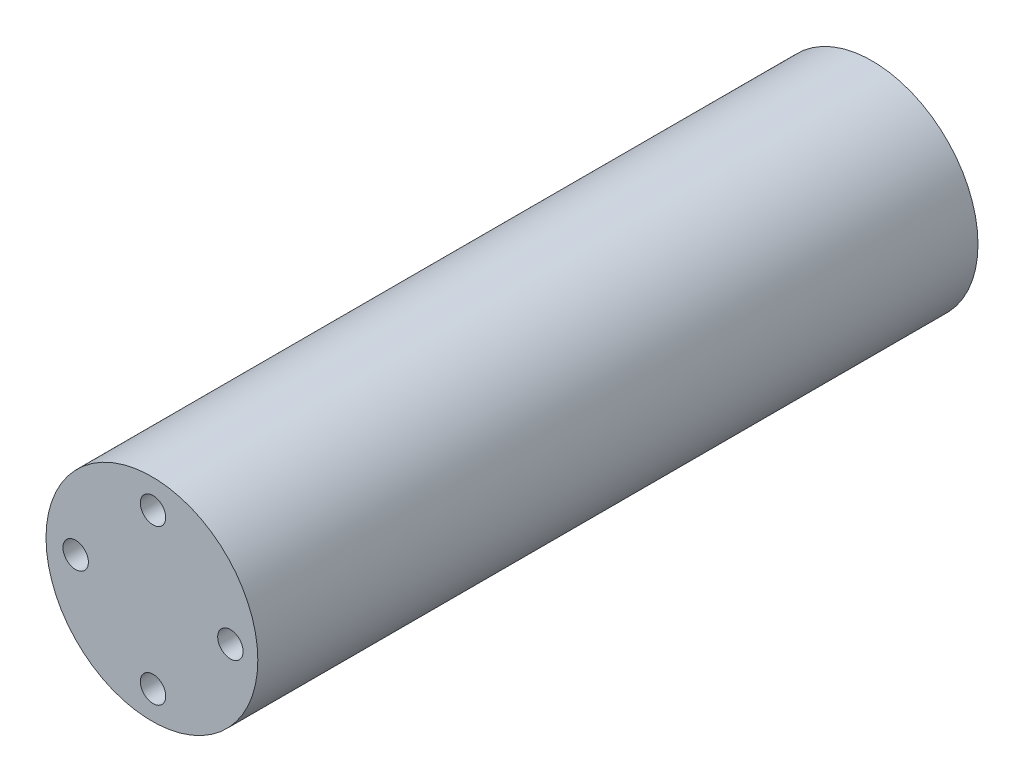
ISO-10303-21;
HEADER;
FILE_DESCRIPTION(('STEP AP214'),'2;1');
FILE_NAME('part.step','',(''),(''),'','','');
FILE_SCHEMA(('AUTOMOTIVE_DESIGN { 1 0 10303 214 1 1 1 1 }'));
ENDSEC;
DATA;
#1=APPLICATION_CONTEXT('core data for automotive mechanical design processes');
#2=APPLICATION_PROTOCOL_DEFINITION('international standard','automotive_design',2000,#1);
#3=PRODUCT_CONTEXT('',#1,'mechanical');
#4=PRODUCT('Part','Part','',(#3));
#5=PRODUCT_RELATED_PRODUCT_CATEGORY('part','',(#4));
#6=PRODUCT_DEFINITION_FORMATION('','',#4);
#7=PRODUCT_DEFINITION_CONTEXT('part definition',#1,'design');
#8=PRODUCT_DEFINITION('design','',#6,#7);
#9=PRODUCT_DEFINITION_SHAPE('','',#8);
#10=(LENGTH_UNIT() NAMED_UNIT(*) SI_UNIT(.MILLI.,.METRE.));
#11=(NAMED_UNIT(*) PLANE_ANGLE_UNIT() SI_UNIT($,.RADIAN.));
#12=(NAMED_UNIT(*) SI_UNIT($,.STERADIAN.) SOLID_ANGLE_UNIT());
#13=UNCERTAINTY_MEASURE_WITH_UNIT(LENGTH_MEASURE(1.E-05),#10,'distance_accuracy_value','');
#14=(GEOMETRIC_REPRESENTATION_CONTEXT(3) GLOBAL_UNCERTAINTY_ASSIGNED_CONTEXT((#13)) GLOBAL_UNIT_ASSIGNED_CONTEXT((#10,
#11,#12)) REPRESENTATION_CONTEXT('',''));
#15=CARTESIAN_POINT('',(0.,0.,0.));
#16=DIRECTION('',(0.,0.,1.));
#17=DIRECTION('',(1.,0.,0.));
#18=AXIS2_PLACEMENT_3D('',#15,#16,#17);
#19=CARTESIAN_POINT('',(0.,0.,170.));
#20=DIRECTION('',(0.,0.,-1.));
#21=DIRECTION('',(-1.,0.,0.));
#22=AXIS2_PLACEMENT_3D('',#19,#20,#21);
#23=CYLINDRICAL_SURFACE('',#22,25.);
#24=CARTESIAN_POINT('',(-20.,-15.,81.9999999999999));
#25=CARTESIAN_POINT('',(-20.1529836876485,-14.7960137514595,82.0000003042341));
#26=CARTESIAN_POINT('',(-20.3030498527288,-14.5893653991028,82.0207943553462));
#27=CARTESIAN_POINT('',(-20.5926719935703,-14.177628440497,82.107264249551));
#28=CARTESIAN_POINT('',(-20.7322214540674,-13.972540870759,82.1729676650143));
#29=CARTESIAN_POINT('',(-20.9636837363068,-13.6219284092466,82.3301033299089));
#30=CARTESIAN_POINT('',(-21.0589296141934,-13.4740447529105,82.4113969260669));
#31=CARTESIAN_POINT('',(-21.2382324020383,-13.1896025144333,82.6017452827361));
#32=CARTESIAN_POINT('',(-21.3222988929055,-13.0530342731439,82.7107760355334));
#33=CARTESIAN_POINT('',(-21.4384010444268,-12.8608204756098,82.8947913883287));
#34=CARTESIAN_POINT('',(-21.4755755669892,-12.7986121530932,82.9598709486563));
#35=CARTESIAN_POINT('',(-21.5461500283249,-12.679439711719,83.0965285293771));
#36=CARTESIAN_POINT('',(-21.5795519248222,-12.622472875775,83.1681031441988));
#37=CARTESIAN_POINT('',(-21.6422830835863,-12.5146108552949,83.3173491804275));
#38=CARTESIAN_POINT('',(-21.6716129824547,-12.4637147218622,83.3950196458521));
#39=CARTESIAN_POINT('',(-21.7259186265956,-12.3688093191014,83.5558506081484));
#40=CARTESIAN_POINT('',(-21.750895119087,-12.3247988680474,83.6390101594882));
#41=CARTESIAN_POINT('',(-21.8130012285078,-12.2147229833967,83.8734247998616));
#42=CARTESIAN_POINT('',(-21.845505303615,-12.1563358109461,84.0296613891371));
#43=CARTESIAN_POINT('',(-21.8954780441919,-12.0660995716992,84.3517753314431));
#44=CARTESIAN_POINT('',(-21.9129576176255,-12.0342312524423,84.5176455967494));
#45=CARTESIAN_POINT('',(-21.9314009385389,-12.0005816631815,84.8367426707088));
#46=CARTESIAN_POINT('',(-21.9338188160281,-11.996151636851,84.9896102660592));
#47=CARTESIAN_POINT('',(-21.9259383072683,-12.010549619046,85.2938860657746));
#48=CARTESIAN_POINT('',(-21.9156431605529,-12.0293717024679,85.445294632023));
#49=CARTESIAN_POINT('',(-21.8830719315045,-12.0885170648943,85.7382520654642));
#50=CARTESIAN_POINT('',(-21.8611200882113,-12.1282582164427,85.8799558166616));
#51=CARTESIAN_POINT('',(-21.8060176097661,-12.2270509648139,86.1541202788457));
#52=CARTESIAN_POINT('',(-21.7728660266034,-12.2861041963094,86.286580206236));
#53=CARTESIAN_POINT('',(-21.694742441987,-12.423550196559,86.5440154677905));
#54=CARTESIAN_POINT('',(-21.649376740403,-12.5025804474752,86.6685293366728));
#55=CARTESIAN_POINT('',(-21.5485631823414,-12.6755447099806,86.9021180860174));
#56=CARTESIAN_POINT('',(-21.4931123048132,-12.7694831863048,87.0111883228256));
#57=CARTESIAN_POINT('',(-21.367775434711,-12.978223720128,87.221798200548));
#58=CARTESIAN_POINT('',(-21.2970280953123,-13.0941523560887,87.321704370392));
#59=CARTESIAN_POINT('',(-21.1465427471124,-13.3358172650062,87.5006273400386));
#60=CARTESIAN_POINT('',(-21.0668005663597,-13.461558080607,87.5796343891944));
#61=CARTESIAN_POINT('',(-20.8882335310598,-13.7372572540461,87.7263789044074));
#62=CARTESIAN_POINT('',(-20.7882983554858,-13.8881473231004,87.7910077229545));
#63=CARTESIAN_POINT('',(-20.5809469663433,-14.1936179631012,87.8940934745095));
#64=CARTESIAN_POINT('',(-20.4735268759621,-14.3482004188677,87.9325367319478));
#65=CARTESIAN_POINT('',(-20.2346779057445,-14.683558918046,87.9888820705365));
#66=CARTESIAN_POINT('',(-20.1022438859851,-14.8643799863077,88.0022578903186));
#67=CARTESIAN_POINT('',(-19.8327337869583,-15.2221212805961,87.997118544484));
#68=CARTESIAN_POINT('',(-19.6956538637322,-15.3990380660827,87.978576305998));
#69=CARTESIAN_POINT('',(-19.3985967234868,-15.7721135271926,87.9060763716796));
#70=CARTESIAN_POINT('',(-19.2383228447809,-15.9670789439655,87.8471377287109));
#71=CARTESIAN_POINT('',(-18.9200758035162,-16.3429289882912,87.6903583986413));
#72=CARTESIAN_POINT('',(-18.7621030336522,-16.5238112348506,87.5925111503999));
#73=CARTESIAN_POINT('',(-18.4818519301266,-16.8361861726911,87.3785815252445));
#74=CARTESIAN_POINT('',(-18.358201789074,-16.9707561407988,87.2687843187807));
#75=CARTESIAN_POINT('',(-18.1215119644899,-17.2232562739351,87.021933578771));
#76=CARTESIAN_POINT('',(-18.0084548284382,-17.3412139758232,86.8849260805585));
#77=CARTESIAN_POINT('',(-17.8287200549007,-17.5256543130122,86.6245161985824));
#78=CARTESIAN_POINT('',(-17.7578385850979,-17.597371545203,86.5077358815821));
#79=CARTESIAN_POINT('',(-17.6291832819573,-17.7262562899641,86.2597515821363));
#80=CARTESIAN_POINT('',(-17.5713906533088,-17.7834446802203,86.128568688906));
#81=CARTESIAN_POINT('',(-17.4823054054841,-17.8709874758938,85.8784427453816));
#82=CARTESIAN_POINT('',(-17.4481079949131,-17.9043270801237,85.761592332573));
#83=CARTESIAN_POINT('',(-17.3940355549447,-17.9568641005462,85.5215436713513));
#84=CARTESIAN_POINT('',(-17.374149126915,-17.9760727722341,85.3983505588683));
#85=CARTESIAN_POINT('',(-17.3504354507536,-17.9989633791077,85.1484064122285));
#86=CARTESIAN_POINT('',(-17.3466788817634,-18.0025769788776,85.0216421641099));
#87=CARTESIAN_POINT('',(-17.3558044871792,-17.9937790592962,84.7692782715859));
#88=CARTESIAN_POINT('',(-17.3686884650073,-17.9813658030318,84.6436787548944));
#89=CARTESIAN_POINT('',(-17.4084704331123,-17.9428492502018,84.405669304335));
#90=CARTESIAN_POINT('',(-17.4343932941331,-17.9176977956542,84.292934710416));
#91=CARTESIAN_POINT('',(-17.4977598140654,-17.8558214500475,84.07413064966));
#92=CARTESIAN_POINT('',(-17.5352085169656,-17.8190914917827,83.9680641254541));
#93=CARTESIAN_POINT('',(-17.637721820625,-17.717728681761,83.7198198636425));
#94=CARTESIAN_POINT('',(-17.7077302993263,-17.6478943420915,83.5818056448409));
#95=CARTESIAN_POINT('',(-17.8613864926419,-17.4923664832266,83.3234053351347));
#96=CARTESIAN_POINT('',(-17.9450649810036,-17.4066371212013,83.2030602089479));
#97=CARTESIAN_POINT('',(-18.1535454433015,-17.189495020554,82.939700147152));
#98=CARTESIAN_POINT('',(-18.2822839024198,-17.0527663056473,82.8041983115772));
#99=CARTESIAN_POINT('',(-18.549180861979,-16.7620707302485,82.5647091050152));
#100=CARTESIAN_POINT('',(-18.6873521817129,-16.6080802209552,82.460765710046));
#101=CARTESIAN_POINT('',(-18.971265249622,-16.2830821077245,82.2817445364064));
#102=CARTESIAN_POINT('',(-19.1171087563326,-16.1117581776848,82.2074075749747));
#103=CARTESIAN_POINT('',(-19.4089071464961,-15.7590136883951,82.091696614631));
#104=CARTESIAN_POINT('',(-19.5548609096884,-15.5776185209924,82.0502434159937));
#105=CARTESIAN_POINT('',(-19.7497645905527,-15.3281963002509,82.0172914780879));
#106=CARTESIAN_POINT('',(-19.8001592205298,-15.2630432709328,82.010833883114));
#107=CARTESIAN_POINT('',(-19.9004717567654,-15.1320204733517,82.0021865241537));
#108=CARTESIAN_POINT('',(-19.9503892853008,-15.0661502133624,81.9999999013404));
#109=CARTESIAN_POINT('',(-20.,-15.,81.9999999999999));
#110=B_SPLINE_CURVE_WITH_KNOTS('',3,(#24,#25,#26,#27,#28,#29,#30,#31,#32,#33,#34,#35,#36,#37,
#38,#39,#40,#41,#42,#43,#44,#45,#46,#47,#48,#49,#50,#51,#52,#53,#54,#55,#56,#57,#58,#59,#60,#61,
#62,#63,#64,#65,#66,#67,#68,#69,#70,#71,#72,#73,#74,#75,#76,#77,#78,#79,#80,#81,#82,#83,#84,#85,
#86,#87,#88,#89,#90,#91,#92,#93,#94,#95,#96,#97,#98,#99,#100,#101,#102,#103,#104,#105,#106,#107,
#108,#109),.UNSPECIFIED.,.T.,.F.,(4,2,2,2,2,2,2,2,2,2,2,2,2,2,2,2,2,2,2,2,2,2,2,2,2,2,2,2,2,2,2,
2,2,2,2,2,2,2,2,2,2,2,4),(0.,0.76461474034488,1.5296993426133,2.10877783112901,2.68735679731074,
2.97920571195896,3.27090247515841,3.5625535840456,3.85415458452158,4.36085384773459,
4.86718492988741,5.32376195680641,5.78022266274087,6.22460485260974,6.66902466698817,
7.12997010737876,7.59105385372671,8.09484869806256,8.59887817886325,9.17320530272717,
9.74783214294384,10.4188300092564,11.0903972958586,11.864633939913,12.6390011985446,
13.2764212412614,13.9127719224509,14.3741026596309,14.8347666745565,15.2119151727491,
15.5887629404005,15.9672603361173,16.3457987549952,16.6994962402673,17.0533487327804,
17.5598677767614,18.067543213691,18.7585954053663,19.45060619004,20.1589831840936,
20.8656488454232,21.1134217723379,21.3613768603682),.UNSPECIFIED.);
#111=CARTESIAN_POINT('',(-20.,-15.,81.9999999999999));
#112=VERTEX_POINT('',#111);
#113=EDGE_CURVE('E41',#112,#112,#110,.T.);
#114=ORIENTED_EDGE('',*,*,#113,.T.);
#115=EDGE_LOOP('',(#114));
#116=FACE_BOUND('',#115,.T.);
#117=CARTESIAN_POINT('',(-20.,15.,82.0000000000001));
#118=CARTESIAN_POINT('',(-19.8477944709792,15.20292981223,82.0000019325239));
#119=CARTESIAN_POINT('',(-19.6923159749158,15.4037492175571,82.0205825375173));
#120=CARTESIAN_POINT('',(-19.3787656297126,15.7964203941662,82.1006766178952));
#121=CARTESIAN_POINT('',(-19.2206863640361,15.9882365993222,82.1603325143348));
#122=CARTESIAN_POINT('',(-18.9808765676314,16.2709227177179,82.2804297561465));
#123=CARTESIAN_POINT('',(-18.8981680182867,16.3668803721164,82.3273348349277));
#124=CARTESIAN_POINT('',(-18.7342353006507,16.5542711937806,82.4317803608472));
#125=CARTESIAN_POINT('',(-18.6530115176063,16.6457031970133,82.4893235263493));
#126=CARTESIAN_POINT('',(-18.4932196716217,16.8230510147501,82.6149901818082));
#127=CARTESIAN_POINT('',(-18.4146462943135,16.9089782220583,82.6830907518063));
#128=CARTESIAN_POINT('',(-18.2612143881544,17.0745654895631,82.8301086616189));
#129=CARTESIAN_POINT('',(-18.1863535951457,17.1542293872979,82.9090192955101));
#130=CARTESIAN_POINT('',(-18.0234886635202,17.3254458786222,83.0993220895382));
#131=CARTESIAN_POINT('',(-17.9369408314935,17.4149188166347,83.2138841437713));
#132=CARTESIAN_POINT('',(-17.7759661447031,17.5791989081497,83.4606402008136));
#133=CARTESIAN_POINT('',(-17.7015195053991,17.6540300415637,83.5928047677338));
#134=CARTESIAN_POINT('',(-17.5833284266079,17.7716646490659,83.845391038694));
#135=CARTESIAN_POINT('',(-17.5364189837097,17.817887267755,83.9627171952584));
#136=CARTESIAN_POINT('',(-17.4566806370467,17.8960172919923,84.2066286208089));
#137=CARTESIAN_POINT('',(-17.4238410420682,17.9279355677906,84.3332067735831));
#138=CARTESIAN_POINT('',(-17.3749493415355,17.9753259626508,84.593711721017));
#139=CARTESIAN_POINT('',(-17.3590293281384,17.9906686905635,84.7276878702475));
#140=CARTESIAN_POINT('',(-17.3462116739231,18.0030286322689,84.9973713515622));
#141=CARTESIAN_POINT('',(-17.3493040478787,18.0000554654911,85.1330777375656));
#142=CARTESIAN_POINT('',(-17.3725870243167,17.9775806038584,85.3847278927772));
#143=CARTESIAN_POINT('',(-17.3906530568116,17.9601324508201,85.5010683881973));
#144=CARTESIAN_POINT('',(-17.4396348202394,17.9125736974617,85.7282901884173));
#145=CARTESIAN_POINT('',(-17.4705559667489,17.88245776042,85.8391691703567));
#146=CARTESIAN_POINT('',(-17.5548650140398,17.7997525313241,86.0879518220381));
#147=CARTESIAN_POINT('',(-17.6122777664187,17.743053464828,86.2231192974797));
#148=CARTESIAN_POINT('',(-17.7411111792212,17.6142356018108,86.478630915289));
#149=CARTESIAN_POINT('',(-17.8125604550199,17.5420852782532,86.5989439449547));
#150=CARTESIAN_POINT('',(-17.9932210908104,17.3570196238295,86.8653412057327));
#151=CARTESIAN_POINT('',(-18.1067060502155,17.2388296330244,87.0048432544269));
#152=CARTESIAN_POINT('',(-18.3446047848897,16.9854590911024,87.2560703673421));
#153=CARTESIAN_POINT('',(-18.4690296522033,16.850261234369,87.3677667893514));
#154=CARTESIAN_POINT('',(-18.7272723335814,16.5628371534072,87.5668841069342));
#155=CARTESIAN_POINT('',(-18.8612531021086,16.4102495381995,87.6535675622314));
#156=CARTESIAN_POINT('',(-19.1316156415121,16.094241300406,87.798727884956));
#157=CARTESIAN_POINT('',(-19.2679978957268,15.9308184783232,87.8571990053469));
#158=CARTESIAN_POINT('',(-19.5689609948556,15.5603334706701,87.9546688125467));
#159=CARTESIAN_POINT('',(-19.7334073936714,15.3513498970774,87.9869368889615));
#160=CARTESIAN_POINT('',(-20.0565178238816,14.9267255244177,88.0066158206633));
#161=CARTESIAN_POINT('',(-20.2151829403584,14.7110859887814,87.9940351378326));
#162=CARTESIAN_POINT('',(-20.4936340209945,14.3198371019042,87.9273236005379));
#163=CARTESIAN_POINT('',(-20.6152161663244,14.1441342440581,87.8812301427227));
#164=CARTESIAN_POINT('',(-20.8482291646024,13.7983549393331,87.7549609024371));
#165=CARTESIAN_POINT('',(-20.9596733309704,13.6282713058152,87.6748306258994));
#166=CARTESIAN_POINT('',(-21.1530082230271,13.3258176123486,87.4946261677533));
#167=CARTESIAN_POINT('',(-21.23680384405,13.1916835079007,87.3995543586086));
#168=CARTESIAN_POINT('',(-21.3928703174307,12.9370531799696,87.1844744809431));
#169=CARTESIAN_POINT('',(-21.4651431428903,12.8165546226363,87.0644706897639));
#170=CARTESIAN_POINT('',(-21.5634381610742,12.6499953324188,86.8668185762337));
#171=CARTESIAN_POINT('',(-21.5946172985001,12.5966635019253,86.7976941290799));
#172=CARTESIAN_POINT('',(-21.653248953063,12.49560751333,86.6540005598897));
#173=CARTESIAN_POINT('',(-21.6807033210122,12.447880571794,86.5794341704547));
#174=CARTESIAN_POINT('',(-21.7316439106224,12.3587336235425,86.425352658123));
#175=CARTESIAN_POINT('',(-21.755130989342,12.3173122548175,86.3458386091675));
#176=CARTESIAN_POINT('',(-21.7979245397055,12.2414204911476,86.1825226518668));
#177=CARTESIAN_POINT('',(-21.8172316172202,12.2069490888889,86.0987213671152));
#178=CARTESIAN_POINT('',(-21.864500224937,12.1221912648118,85.8624150511083));
#179=CARTESIAN_POINT('',(-21.8879057599775,12.079763601205,85.7060466751688));
#180=CARTESIAN_POINT('',(-21.9204134868773,12.0206755003735,85.3871967516171));
#181=CARTESIAN_POINT('',(-21.9295236922246,12.0040006270709,85.2247186812437));
#182=CARTESIAN_POINT('',(-21.9330586661565,11.9975383433251,84.9117520439486));
#183=CARTESIAN_POINT('',(-21.9285706860368,12.0057602622548,84.7613140141272));
#184=CARTESIAN_POINT('',(-21.907354377145,12.0444304635475,84.4642380523158));
#185=CARTESIAN_POINT('',(-21.890627921674,12.0748753443171,84.3175995423028));
#186=CARTESIAN_POINT('',(-21.8455760472639,12.1561886641032,84.0333465271669));
#187=CARTESIAN_POINT('',(-21.817346971293,12.2068873946612,83.8956678256615));
#188=CARTESIAN_POINT('',(-21.7500134339135,12.3264594490584,83.6313373758179));
#189=CARTESIAN_POINT('',(-21.7109071464172,12.3953358244969,83.5046874837099));
#190=CARTESIAN_POINT('',(-21.62040459041,12.5525587118807,83.2586032362365));
#191=CARTESIAN_POINT('',(-21.5684676481222,12.6417424036931,83.1399049232281));
#192=CARTESIAN_POINT('',(-21.454798254333,12.833708350007,82.9194791182845));
#193=CARTESIAN_POINT('',(-21.3930632102191,12.9364942024889,82.8177561327369));
#194=CARTESIAN_POINT('',(-21.2540807809356,13.1637219040807,82.6224288647622));
#195=CARTESIAN_POINT('',(-21.1758823049436,13.2893043592058,82.5308335105105));
#196=CARTESIAN_POINT('',(-21.0108031332585,13.5487948991069,82.3699132342094));
#197=CARTESIAN_POINT('',(-20.9239148362794,13.6827102335685,82.3006080374891));
#198=CARTESIAN_POINT('',(-20.7295545108893,13.9757258308862,82.175120400255));
#199=CARTESIAN_POINT('',(-20.6209519964701,14.1355850469597,82.1224785826352));
#200=CARTESIAN_POINT('',(-20.3969531788435,14.4569219283289,82.0449436494085));
#201=CARTESIAN_POINT('',(-20.281564497122,14.618397615163,82.0200200074893));
#202=CARTESIAN_POINT('',(-20.1097316943929,14.8528510935314,82.0026935272202));
#203=CARTESIAN_POINT('',(-20.0550801565422,14.9265637332847,81.9999993006581));
#204=CARTESIAN_POINT('',(-20.,15.,82.0000000000001));
#205=B_SPLINE_CURVE_WITH_KNOTS('',3,(#117,#118,#119,#120,#121,#122,#123,#124,#125,#126,#127,
#128,#129,#130,#131,#132,#133,#134,#135,#136,#137,#138,#139,#140,#141,#142,#143,#144,#145,#146,
#147,#148,#149,#150,#151,#152,#153,#154,#155,#156,#157,#158,#159,#160,#161,#162,#163,#164,#165,
#166,#167,#168,#169,#170,#171,#172,#173,#174,#175,#176,#177,#178,#179,#180,#181,#182,#183,#184,
#185,#186,#187,#188,#189,#190,#191,#192,#193,#194,#195,#196,#197,#198,#199,#200,#201,#202,#203,
#204),.UNSPECIFIED.,.T.,.F.,(4,2,2,2,2,2,2,2,2,2,2,2,2,2,2,2,2,2,2,2,2,2,2,2,2,2,2,2,2,2,2,2,2,
2,2,2,2,2,2,2,2,2,2,4),(0.,0.76078509686969,1.52435863842068,1.92919877324071,2.33414250072205,
2.73821910480941,3.14204616932536,3.64787489399265,4.15286812278573,4.55495138392817,
4.956728571034,5.3616199189349,5.76629863776594,6.12177522956864,6.47740172782835,
6.94707180301713,7.41770949137056,8.05982595255434,8.7026011377126,9.36274343368335,
10.0230201482229,10.8228952847394,11.6226195120444,12.2757793531859,12.9280686794647,
13.4794581007645,14.0307530034548,14.3085385396451,14.5861855366036,14.8637724762035,
15.1413191539565,15.6295544526878,16.1175159649966,16.5675189655852,17.0174531001798,
17.4636937284926,17.910009317823,18.3799333160967,18.849981865873,19.3699407996101,
19.8903586049312,20.4890359985105,21.0870534075711,21.3623664168956),.UNSPECIFIED.);
#206=CARTESIAN_POINT('',(-20.,15.,82.0000000000001));
#207=VERTEX_POINT('',#206);
#208=EDGE_CURVE('E66',#207,#207,#205,.T.);
#209=ORIENTED_EDGE('',*,*,#208,.T.);
#210=EDGE_LOOP('',(#209));
#211=FACE_BOUND('',#210,.T.);
#212=CARTESIAN_POINT('',(-25.,0.,88.));
#213=CARTESIAN_POINT('',(-24.9999977357459,-0.1678640471077,87.9999928360586));
#214=CARTESIAN_POINT('',(-24.9982914200408,-0.335834317331193,87.9858633413073));
#215=CARTESIAN_POINT('',(-24.991648705422,-0.667104571308252,87.9297189358446));
#216=CARTESIAN_POINT('',(-24.9867088933728,-0.830399429590071,87.8876745587494));
#217=CARTESIAN_POINT('',(-24.9741559265426,-1.14747479534053,87.776953723474));
#218=CARTESIAN_POINT('',(-24.9665445315309,-1.30126148759225,87.7082947931758));
#219=CARTESIAN_POINT('',(-24.9494959264345,-1.595099157832,87.5463312649167));
#220=CARTESIAN_POINT('',(-24.9400590404141,-1.73515256713516,87.4530310402467));
#221=CARTESIAN_POINT('',(-24.920360105442,-1.99829131534451,87.2439251380248));
#222=CARTESIAN_POINT('',(-24.9100945030904,-2.1212966913072,87.1280191598881));
#223=CARTESIAN_POINT('',(-24.8899239397152,-2.34615931038342,86.8772070351121));
#224=CARTESIAN_POINT('',(-24.8800189967068,-2.44801549826474,86.7422999409814));
#225=CARTESIAN_POINT('',(-24.8616560370405,-2.62798342873896,86.4567991747016));
#226=CARTESIAN_POINT('',(-24.8532025903971,-2.7060207567257,86.3061582754199));
#227=CARTESIAN_POINT('',(-24.8387461344686,-2.8356605730156,85.9937912978913));
#228=CARTESIAN_POINT('',(-24.8327430393798,-2.88726398696777,85.8320656080307));
#229=CARTESIAN_POINT('',(-24.8239006073737,-2.962329300454,85.5029471406886));
#230=CARTESIAN_POINT('',(-24.8210461452543,-2.98592577987647,85.3355854715723));
#231=CARTESIAN_POINT('',(-24.8187777690611,-3.00472375219671,84.9992550636358));
#232=CARTESIAN_POINT('',(-24.8193637271033,-2.99992630052849,84.830286384783));
#233=CARTESIAN_POINT('',(-24.8238961466306,-2.96218316078669,84.4964740352157));
#234=CARTESIAN_POINT('',(-24.8278249434675,-2.92938543222304,84.3316133613198));
#235=CARTESIAN_POINT('',(-24.8385728087608,-2.83680346170068,84.0097529721786));
#236=CARTESIAN_POINT('',(-24.8453919315688,-2.77701871225815,83.852753404821));
#237=CARTESIAN_POINT('',(-24.8611722079476,-2.63199980699862,83.5506105317609));
#238=CARTESIAN_POINT('',(-24.8701387862198,-2.54670106203926,83.4054985216465));
#239=CARTESIAN_POINT('',(-24.8891993987901,-2.3531217316947,83.1315927890843));
#240=CARTESIAN_POINT('',(-24.8992934806213,-2.24484017723158,83.0027997550974));
#241=CARTESIAN_POINT('',(-24.9195503308637,-2.00754755562181,82.7643289156356));
#242=CARTESIAN_POINT('',(-24.929713127424,-1.87840890051216,82.6547780301429));
#243=CARTESIAN_POINT('',(-24.9489020798549,-1.60350795893872,82.4588884789997));
#244=CARTESIAN_POINT('',(-24.9579282334421,-1.45774563908004,82.3725498599808));
#245=CARTESIAN_POINT('',(-24.9738318861702,-1.15363930826284,82.2255367143603));
#246=CARTESIAN_POINT('',(-24.9807087472809,-0.995291578715586,82.1648698066696));
#247=CARTESIAN_POINT('',(-24.991533065309,-0.670556022273436,82.0710212621491));
#248=CARTESIAN_POINT('',(-24.9954806485584,-0.504168542441621,82.0378384399955));
#249=CARTESIAN_POINT('',(-24.9999852500304,-0.169174396374216,82.0000637445023));
#250=CARTESIAN_POINT('',(-25.0005630093753,-0.000587720432051417,81.9952969675993));
#251=CARTESIAN_POINT('',(-24.9983187823231,0.33498206824326,82.0140285778683));
#252=CARTESIAN_POINT('',(-24.9954968625308,0.501965212327328,82.0375264112953));
#253=CARTESIAN_POINT('',(-24.9867833380686,0.829074263928357,82.1119749640031));
#254=CARTESIAN_POINT('',(-24.9809010237909,0.989219346369038,82.1628426130501));
#255=CARTESIAN_POINT('',(-24.9667255501792,1.29870539768646,82.2905007033536));
#256=CARTESIAN_POINT('',(-24.9584323148759,1.44804602592348,82.3672919614901));
#257=CARTESIAN_POINT('',(-24.9403085158695,1.73246717766505,82.5450429159024));
#258=CARTESIAN_POINT('',(-24.9304708084643,1.86747628962751,82.6461161378108));
#259=CARTESIAN_POINT('',(-24.9103817919419,2.11867625152204,82.8694008464082));
#260=CARTESIAN_POINT('',(-24.9001304677484,2.2348664147295,82.9916131041479));
#261=CARTESIAN_POINT('',(-24.8803059484942,2.44574795226154,83.2544756154277));
#262=CARTESIAN_POINT('',(-24.8707365831307,2.54032363231939,83.3952190153438));
#263=CARTESIAN_POINT('',(-24.8534214993383,2.70449314429332,83.6906950250755));
#264=CARTESIAN_POINT('',(-24.8456757467943,2.77408744356074,83.8454273731182));
#265=CARTESIAN_POINT('',(-24.8329105734502,2.88612996668159,84.1641106088947));
#266=CARTESIAN_POINT('',(-24.8278845275633,2.92864420159347,84.3280380118594));
#267=CARTESIAN_POINT('',(-24.8211085274587,2.98553272163517,84.6607689694851));
#268=CARTESIAN_POINT('',(-24.8193584337106,2.99990820526082,84.8295723161573));
#269=CARTESIAN_POINT('',(-24.8193363266069,3.00009033817931,85.1661127296372));
#270=CARTESIAN_POINT('',(-24.8210421863943,2.98607873671351,85.3338497257713));
#271=CARTESIAN_POINT('',(-24.8276922947425,2.9302684867209,85.6645667863942));
#272=CARTESIAN_POINT('',(-24.8326365444657,2.88846982822068,85.8275468491756));
#273=CARTESIAN_POINT('',(-24.8451996524586,2.77832739820546,86.1441045388887));
#274=CARTESIAN_POINT('',(-24.8528177016812,2.7099916557054,86.2976849934955));
#275=CARTESIAN_POINT('',(-24.8698714539139,2.5487328262801,86.5912277470701));
#276=CARTESIAN_POINT('',(-24.8793071726153,2.45580952709446,86.7311899284593));
#277=CARTESIAN_POINT('',(-24.8990055122588,2.24733689647206,86.9944529401088));
#278=CARTESIAN_POINT('',(-24.9092728581347,2.13165203930151,87.1176461032663));
#279=CARTESIAN_POINT('',(-24.9294354968169,1.88122093334448,87.342942479566));
#280=CARTESIAN_POINT('',(-24.939330701051,1.74647018263601,87.4450406976292));
#281=CARTESIAN_POINT('',(-24.9576721709324,1.46119322465137,87.6255505779989));
#282=CARTESIAN_POINT('',(-24.966113221621,1.31061323462417,87.7038777257223));
#283=CARTESIAN_POINT('',(-24.9805418519727,0.998422751685308,87.8340237644426));
#284=CARTESIAN_POINT('',(-24.9865321180615,0.836824564362142,87.8858716961804));
#285=CARTESIAN_POINT('',(-24.9939268325999,0.561977101236695,87.9490634203381));
#286=CARTESIAN_POINT('',(-24.996193279433,0.450466569753486,87.9681374838864));
#287=CARTESIAN_POINT('',(-24.9992306204204,0.225986735693694,87.993608143491));
#288=CARTESIAN_POINT('',(-25.0000015244492,0.113017442753625,88.0000048232505));
#289=CARTESIAN_POINT('',(-25.,0.,88.));
#290=B_SPLINE_CURVE_WITH_KNOTS('',3,(#212,#213,#214,#215,#216,#217,#218,#219,#220,#221,#222,
#223,#224,#225,#226,#227,#228,#229,#230,#231,#232,#233,#234,#235,#236,#237,#238,#239,#240,#241,
#242,#243,#244,#245,#246,#247,#248,#249,#250,#251,#252,#253,#254,#255,#256,#257,#258,#259,#260,
#261,#262,#263,#264,#265,#266,#267,#268,#269,#270,#271,#272,#273,#274,#275,#276,#277,#278,#279,
#280,#281,#282,#283,#284,#285,#286,#287,#288,#289),.UNSPECIFIED.,.T.,.F.,(4,2,2,2,2,2,2,2,2,2,2,
2,2,2,2,2,2,2,2,2,2,2,2,2,2,2,2,2,2,2,2,2,2,2,2,2,2,2,4),(0.,0.503179350956162,1.00689069408623,
1.51027086375561,2.01356175441693,2.51913872195877,3.02474090904882,3.53190689496398,
4.03905511999114,4.54375638343279,5.0484388866848,5.55047092912253,6.05251241253397,
6.55583573710536,7.05918028869263,7.56572944640319,8.07227962172604,8.57898002694281,
9.08565857822622,9.58921522624228,10.0927620090108,10.5947890255775,11.0968318630167,
11.6012692178557,12.1057249760357,12.6128207581672,13.119907053063,13.6257524826489,
14.1315763666155,14.634171931923,15.1367676776234,15.6392114771389,16.1416596143122,
16.6471952402032,17.152850435201,17.6602829023946,18.1671576479275,18.5059342945627,
18.8447087043981),.UNSPECIFIED.);
#291=CARTESIAN_POINT('',(-25.,0.,88.));
#292=VERTEX_POINT('',#291);
#293=EDGE_CURVE('E60',#292,#292,#290,.T.);
#294=ORIENTED_EDGE('',*,*,#293,.T.);
#295=EDGE_LOOP('',(#294));
#296=FACE_BOUND('',#295,.T.);
#297=CARTESIAN_POINT('',(0.,0.,170.));
#298=DIRECTION('',(0.,0.,1.));
#299=DIRECTION('',(1.,0.,0.));
#300=AXIS2_PLACEMENT_3D('',#297,#298,#299);
#301=CIRCLE('',#300,25.);
#302=CARTESIAN_POINT('',(25.,0.,170.));
#303=VERTEX_POINT('',#302);
#304=EDGE_CURVE('E10',#303,#303,#301,.T.);
#305=ORIENTED_EDGE('',*,*,#304,.F.);
#306=EDGE_LOOP('',(#305));
#307=FACE_BOUND('',#306,.T.);
#308=CARTESIAN_POINT('',(0.,0.,0.));
#309=DIRECTION('',(0.,0.,1.));
#310=DIRECTION('',(1.,0.,0.));
#311=AXIS2_PLACEMENT_3D('',#308,#309,#310);
#312=CIRCLE('',#311,25.);
#313=CARTESIAN_POINT('',(25.,0.,0.));
#314=VERTEX_POINT('',#313);
#315=EDGE_CURVE('E49',#314,#314,#312,.T.);
#316=ORIENTED_EDGE('',*,*,#315,.T.);
#317=EDGE_LOOP('',(#316));
#318=FACE_BOUND('',#317,.T.);
#319=ADVANCED_FACE('F37',(#116,#211,#296,#307,#318),#23,.T.);
#320=CARTESIAN_POINT('',(0.,0.,170.));
#321=DIRECTION('',(0.,0.,1.));
#322=DIRECTION('',(1.,0.,0.));
#323=AXIS2_PLACEMENT_3D('',#320,#321,#322);
#324=PLANE('',#323);
#325=CARTESIAN_POINT('',(0.262987012987076,-18.262987012987,170.));
#326=DIRECTION('',(0.,0.,1.));
#327=DIRECTION('',(0.,1.,0.));
#328=AXIS2_PLACEMENT_3D('',#325,#326,#327);
#329=CIRCLE('',#328,3.);
#330=CARTESIAN_POINT('',(0.262987012987066,-15.262987012987,170.));
#331=VERTEX_POINT('',#330);
#332=EDGE_CURVE('E193',#331,#331,#329,.T.);
#333=ORIENTED_EDGE('',*,*,#332,.F.);
#334=EDGE_LOOP('',(#333));
#335=FACE_BOUND('',#334,.T.);
#336=CARTESIAN_POINT('',(18.525974025974,0.,170.));
#337=DIRECTION('',(0.,0.,1.));
#338=DIRECTION('',(-1.,0.,0.));
#339=AXIS2_PLACEMENT_3D('',#336,#337,#338);
#340=CIRCLE('',#339,3.);
#341=CARTESIAN_POINT('',(15.525974025974,0.,170.));
#342=VERTEX_POINT('',#341);
#343=EDGE_CURVE('E199',#342,#342,#340,.T.);
#344=ORIENTED_EDGE('',*,*,#343,.F.);
#345=EDGE_LOOP('',(#344));
#346=FACE_BOUND('',#345,.T.);
#347=CARTESIAN_POINT('',(0.262987012986821,18.262987012987,170.));
#348=DIRECTION('',(0.,0.,1.));
#349=DIRECTION('',(0.,-1.,0.));
#350=AXIS2_PLACEMENT_3D('',#347,#348,#349);
#351=CIRCLE('',#350,3.);
#352=CARTESIAN_POINT('',(0.262987012986853,15.262987012987,170.));
#353=VERTEX_POINT('',#352);
#354=EDGE_CURVE('E185',#353,#353,#351,.T.);
#355=ORIENTED_EDGE('',*,*,#354,.F.);
#356=EDGE_LOOP('',(#355));
#357=FACE_BOUND('',#356,.T.);
#358=CARTESIAN_POINT('',(-18.,0.,170.));
#359=DIRECTION('',(0.,0.,1.));
#360=DIRECTION('',(1.,0.,0.));
#361=AXIS2_PLACEMENT_3D('',#358,#359,#360);
#362=CIRCLE('',#361,3.);
#363=CARTESIAN_POINT('',(-15.,0.,170.));
#364=VERTEX_POINT('',#363);
#365=EDGE_CURVE('E57',#364,#364,#362,.T.);
#366=ORIENTED_EDGE('',*,*,#365,.F.);
#367=EDGE_LOOP('',(#366));
#368=FACE_BOUND('',#367,.T.);
#369=ORIENTED_EDGE('',*,*,#304,.T.);
#370=EDGE_LOOP('',(#369));
#371=FACE_BOUND('',#370,.T.);
#372=ADVANCED_FACE('F145',(#335,#346,#357,#368,#371),#324,.T.);
#373=CARTESIAN_POINT('',(0.,0.,0.));
#374=DIRECTION('',(0.,0.,1.));
#375=DIRECTION('',(1.,0.,0.));
#376=AXIS2_PLACEMENT_3D('',#373,#374,#375);
#377=PLANE('',#376);
#378=CARTESIAN_POINT('',(-0.0160739091128938,-17.983926090887,0.));
#379=DIRECTION('',(0.,0.,1.));
#380=DIRECTION('',(0.,1.,0.));
#381=AXIS2_PLACEMENT_3D('',#378,#379,#380);
#382=CIRCLE('',#381,3.);
#383=CARTESIAN_POINT('',(-0.0160739091129042,-14.983926090887,0.));
#384=VERTEX_POINT('',#383);
#385=EDGE_CURVE('E226',#384,#384,#382,.T.);
#386=ORIENTED_EDGE('',*,*,#385,.T.);
#387=EDGE_LOOP('',(#386));
#388=FACE_BOUND('',#387,.T.);
#389=CARTESIAN_POINT('',(17.9678521817741,0.,0.));
#390=DIRECTION('',(0.,0.,1.));
#391=DIRECTION('',(-1.,0.,0.));
#392=AXIS2_PLACEMENT_3D('',#389,#390,#391);
#393=CIRCLE('',#392,3.);
#394=CARTESIAN_POINT('',(14.9678521817741,0.,0.));
#395=VERTEX_POINT('',#394);
#396=EDGE_CURVE('E178',#395,#395,#393,.T.);
#397=ORIENTED_EDGE('',*,*,#396,.T.);
#398=EDGE_LOOP('',(#397));
#399=FACE_BOUND('',#398,.T.);
#400=CARTESIAN_POINT('',(-0.0160739091131449,17.983926090887,0.));
#401=DIRECTION('',(0.,0.,1.));
#402=DIRECTION('',(0.,-1.,0.));
#403=AXIS2_PLACEMENT_3D('',#400,#401,#402);
#404=CIRCLE('',#403,3.);
#405=CARTESIAN_POINT('',(-0.0160739091131135,14.983926090887,0.));
#406=VERTEX_POINT('',#405);
#407=EDGE_CURVE('E171',#406,#406,#404,.T.);
#408=ORIENTED_EDGE('',*,*,#407,.T.);
#409=EDGE_LOOP('',(#408));
#410=FACE_BOUND('',#409,.T.);
#411=CARTESIAN_POINT('',(-18.,0.,0.));
#412=DIRECTION('',(0.,0.,1.));
#413=DIRECTION('',(1.,0.,0.));
#414=AXIS2_PLACEMENT_3D('',#411,#412,#413);
#415=CIRCLE('',#414,3.);
#416=CARTESIAN_POINT('',(-15.,0.,0.));
#417=VERTEX_POINT('',#416);
#418=EDGE_CURVE('E186',#417,#417,#415,.T.);
#419=ORIENTED_EDGE('',*,*,#418,.T.);
#420=EDGE_LOOP('',(#419));
#421=FACE_BOUND('',#420,.T.);
#422=ORIENTED_EDGE('',*,*,#315,.F.);
#423=EDGE_LOOP('',(#422));
#424=FACE_BOUND('',#423,.T.);
#425=ADVANCED_FACE('F143',(#388,#399,#410,#421,#424),#377,.F.);
#426=CARTESIAN_POINT('',(-18.,0.,160.));
#427=DIRECTION('',(0.,0.,1.));
#428=DIRECTION('',(1.,0.,0.));
#429=AXIS2_PLACEMENT_3D('',#426,#427,#428);
#430=CYLINDRICAL_SURFACE('',#429,3.);
#431=CARTESIAN_POINT('',(-18.,0.,160.));
#432=DIRECTION('',(0.,0.,1.));
#433=DIRECTION('',(1.,0.,0.));
#434=AXIS2_PLACEMENT_3D('',#431,#432,#433);
#435=CIRCLE('',#434,3.);
#436=CARTESIAN_POINT('',(-15.,0.,160.));
#437=VERTEX_POINT('',#436);
#438=EDGE_CURVE('E54',#437,#437,#435,.T.);
#439=ORIENTED_EDGE('',*,*,#438,.F.);
#440=EDGE_LOOP('',(#439));
#441=FACE_BOUND('',#440,.T.);
#442=ORIENTED_EDGE('',*,*,#365,.T.);
#443=EDGE_LOOP('',(#442));
#444=FACE_BOUND('',#443,.T.);
#445=ADVANCED_FACE('F139',(#441,#444),#430,.F.);
#446=CARTESIAN_POINT('',(0.,0.,160.));
#447=DIRECTION('',(0.,0.,1.));
#448=DIRECTION('',(1.,0.,0.));
#449=AXIS2_PLACEMENT_3D('',#446,#447,#448);
#450=PLANE('',#449);
#451=ORIENTED_EDGE('',*,*,#438,.T.);
#452=EDGE_LOOP('',(#451));
#453=FACE_BOUND('',#452,.T.);
#454=ADVANCED_FACE('F135',(#453),#450,.T.);
#455=CARTESIAN_POINT('',(0.262987012986821,18.262987012987,160.));
#456=DIRECTION('',(0.,0.,1.));
#457=DIRECTION('',(1.,0.,0.));
#458=AXIS2_PLACEMENT_3D('',#455,#456,#457);
#459=CYLINDRICAL_SURFACE('',#458,3.);
#460=CARTESIAN_POINT('',(0.262987012986821,18.262987012987,160.));
#461=DIRECTION('',(0.,0.,1.));
#462=DIRECTION('',(0.,-1.,0.));
#463=AXIS2_PLACEMENT_3D('',#460,#461,#462);
#464=CIRCLE('',#463,3.);
#465=CARTESIAN_POINT('',(0.262987012986853,15.262987012987,160.));
#466=VERTEX_POINT('',#465);
#467=EDGE_CURVE('E202',#466,#466,#464,.T.);
#468=ORIENTED_EDGE('',*,*,#467,.F.);
#469=EDGE_LOOP('',(#468));
#470=FACE_BOUND('',#469,.T.);
#471=ORIENTED_EDGE('',*,*,#354,.T.);
#472=EDGE_LOOP('',(#471));
#473=FACE_BOUND('',#472,.T.);
#474=ADVANCED_FACE('F131',(#470,#473),#459,.F.);
#475=CARTESIAN_POINT('',(0.26298701298701,0.262987012987013,160.));
#476=DIRECTION('',(0.,0.,1.));
#477=DIRECTION('',(0.,-1.,0.));
#478=AXIS2_PLACEMENT_3D('',#475,#476,#477);
#479=PLANE('',#478);
#480=ORIENTED_EDGE('',*,*,#467,.T.);
#481=EDGE_LOOP('',(#480));
#482=FACE_BOUND('',#481,.T.);
#483=ADVANCED_FACE('F127',(#482),#479,.T.);
#484=CARTESIAN_POINT('',(18.525974025974,0.,160.));
#485=DIRECTION('',(0.,0.,1.));
#486=DIRECTION('',(1.,0.,0.));
#487=AXIS2_PLACEMENT_3D('',#484,#485,#486);
#488=CYLINDRICAL_SURFACE('',#487,3.);
#489=CARTESIAN_POINT('',(18.525974025974,0.,160.));
#490=DIRECTION('',(0.,0.,1.));
#491=DIRECTION('',(-1.,0.,0.));
#492=AXIS2_PLACEMENT_3D('',#489,#490,#491);
#493=CIRCLE('',#492,3.);
#494=CARTESIAN_POINT('',(15.525974025974,0.,160.));
#495=VERTEX_POINT('',#494);
#496=EDGE_CURVE('E196',#495,#495,#493,.T.);
#497=ORIENTED_EDGE('',*,*,#496,.F.);
#498=EDGE_LOOP('',(#497));
#499=FACE_BOUND('',#498,.T.);
#500=ORIENTED_EDGE('',*,*,#343,.T.);
#501=EDGE_LOOP('',(#500));
#502=FACE_BOUND('',#501,.T.);
#503=ADVANCED_FACE('F123',(#499,#502),#488,.F.);
#504=CARTESIAN_POINT('',(0.525974025974025,0.,160.));
#505=DIRECTION('',(0.,0.,1.));
#506=DIRECTION('',(-1.,0.,0.));
#507=AXIS2_PLACEMENT_3D('',#504,#505,#506);
#508=PLANE('',#507);
#509=ORIENTED_EDGE('',*,*,#496,.T.);
#510=EDGE_LOOP('',(#509));
#511=FACE_BOUND('',#510,.T.);
#512=ADVANCED_FACE('F119',(#511),#508,.T.);
#513=CARTESIAN_POINT('',(0.262987012987076,-18.262987012987,160.));
#514=DIRECTION('',(0.,0.,1.));
#515=DIRECTION('',(1.,0.,0.));
#516=AXIS2_PLACEMENT_3D('',#513,#514,#515);
#517=CYLINDRICAL_SURFACE('',#516,3.);
#518=CARTESIAN_POINT('',(0.262987012987076,-18.262987012987,160.));
#519=DIRECTION('',(0.,0.,1.));
#520=DIRECTION('',(0.,1.,0.));
#521=AXIS2_PLACEMENT_3D('',#518,#519,#520);
#522=CIRCLE('',#521,3.);
#523=CARTESIAN_POINT('',(0.262987012987066,-15.262987012987,160.));
#524=VERTEX_POINT('',#523);
#525=EDGE_CURVE('E190',#524,#524,#522,.T.);
#526=ORIENTED_EDGE('',*,*,#525,.F.);
#527=EDGE_LOOP('',(#526));
#528=FACE_BOUND('',#527,.T.);
#529=ORIENTED_EDGE('',*,*,#332,.T.);
#530=EDGE_LOOP('',(#529));
#531=FACE_BOUND('',#530,.T.);
#532=ADVANCED_FACE('F115',(#528,#531),#517,.F.);
#533=CARTESIAN_POINT('',(0.262987012987014,-0.262987012987013,160.));
#534=DIRECTION('',(0.,0.,1.));
#535=DIRECTION('',(0.,1.,0.));
#536=AXIS2_PLACEMENT_3D('',#533,#534,#535);
#537=PLANE('',#536);
#538=ORIENTED_EDGE('',*,*,#525,.T.);
#539=EDGE_LOOP('',(#538));
#540=FACE_BOUND('',#539,.T.);
#541=ADVANCED_FACE('F111',(#540),#537,.T.);
#542=CARTESIAN_POINT('',(-18.,0.,10.));
#543=DIRECTION('',(0.,0.,-1.));
#544=DIRECTION('',(-1.,0.,0.));
#545=AXIS2_PLACEMENT_3D('',#542,#543,#544);
#546=CYLINDRICAL_SURFACE('',#545,3.);
#547=CARTESIAN_POINT('',(-18.,0.,10.));
#548=DIRECTION('',(0.,0.,1.));
#549=DIRECTION('',(1.,0.,0.));
#550=AXIS2_PLACEMENT_3D('',#547,#548,#549);
#551=CIRCLE('',#550,3.);
#552=CARTESIAN_POINT('',(-15.,0.,10.));
#553=VERTEX_POINT('',#552);
#554=EDGE_CURVE('E182',#553,#553,#551,.T.);
#555=ORIENTED_EDGE('',*,*,#554,.T.);
#556=EDGE_LOOP('',(#555));
#557=FACE_BOUND('',#556,.T.);
#558=ORIENTED_EDGE('',*,*,#418,.F.);
#559=EDGE_LOOP('',(#558));
#560=FACE_BOUND('',#559,.T.);
#561=ADVANCED_FACE('F107',(#557,#560),#546,.F.);
#562=CARTESIAN_POINT('',(0.,0.,10.));
#563=DIRECTION('',(0.,0.,-1.));
#564=DIRECTION('',(1.,0.,0.));
#565=AXIS2_PLACEMENT_3D('',#562,#563,#564);
#566=PLANE('',#565);
#567=ORIENTED_EDGE('',*,*,#554,.F.);
#568=EDGE_LOOP('',(#567));
#569=FACE_BOUND('',#568,.T.);
#570=ADVANCED_FACE('F103',(#569),#566,.T.);
#571=CARTESIAN_POINT('',(-0.0160739091131449,17.983926090887,10.));
#572=DIRECTION('',(0.,0.,-1.));
#573=DIRECTION('',(-1.,0.,0.));
#574=AXIS2_PLACEMENT_3D('',#571,#572,#573);
#575=CYLINDRICAL_SURFACE('',#574,3.);
#576=CARTESIAN_POINT('',(-0.0160739091131449,17.983926090887,10.));
#577=DIRECTION('',(0.,0.,1.));
#578=DIRECTION('',(0.,-1.,0.));
#579=AXIS2_PLACEMENT_3D('',#576,#577,#578);
#580=CIRCLE('',#579,3.);
#581=CARTESIAN_POINT('',(-0.0160739091131135,14.983926090887,10.));
#582=VERTEX_POINT('',#581);
#583=EDGE_CURVE('E173',#582,#582,#580,.T.);
#584=ORIENTED_EDGE('',*,*,#583,.T.);
#585=EDGE_LOOP('',(#584));
#586=FACE_BOUND('',#585,.T.);
#587=ORIENTED_EDGE('',*,*,#407,.F.);
#588=EDGE_LOOP('',(#587));
#589=FACE_BOUND('',#588,.T.);
#590=ADVANCED_FACE('F99',(#586,#589),#575,.F.);
#591=CARTESIAN_POINT('',(-0.0160739091129564,-0.0160739091129565,10.));
#592=DIRECTION('',(0.,0.,-1.));
#593=DIRECTION('',(0.,-1.,0.));
#594=AXIS2_PLACEMENT_3D('',#591,#592,#593);
#595=PLANE('',#594);
#596=ORIENTED_EDGE('',*,*,#583,.F.);
#597=EDGE_LOOP('',(#596));
#598=FACE_BOUND('',#597,.T.);
#599=ADVANCED_FACE('F95',(#598),#595,.T.);
#600=CARTESIAN_POINT('',(17.9678521817741,0.,10.));
#601=DIRECTION('',(0.,0.,-1.));
#602=DIRECTION('',(-1.,0.,0.));
#603=AXIS2_PLACEMENT_3D('',#600,#601,#602);
#604=CYLINDRICAL_SURFACE('',#603,3.);
#605=CARTESIAN_POINT('',(17.9678521817741,0.,10.));
#606=DIRECTION('',(0.,0.,1.));
#607=DIRECTION('',(-1.,0.,0.));
#608=AXIS2_PLACEMENT_3D('',#605,#606,#607);
#609=CIRCLE('',#608,3.);
#610=CARTESIAN_POINT('',(14.9678521817741,0.,10.));
#611=VERTEX_POINT('',#610);
#612=EDGE_CURVE('E229',#611,#611,#609,.T.);
#613=ORIENTED_EDGE('',*,*,#612,.T.);
#614=EDGE_LOOP('',(#613));
#615=FACE_BOUND('',#614,.T.);
#616=ORIENTED_EDGE('',*,*,#396,.F.);
#617=EDGE_LOOP('',(#616));
#618=FACE_BOUND('',#617,.T.);
#619=ADVANCED_FACE('F91',(#615,#618),#604,.F.);
#620=CARTESIAN_POINT('',(-0.0321478182259131,0.,10.));
#621=DIRECTION('',(0.,0.,-1.));
#622=DIRECTION('',(-1.,0.,0.));
#623=AXIS2_PLACEMENT_3D('',#620,#621,#622);
#624=PLANE('',#623);
#625=ORIENTED_EDGE('',*,*,#612,.F.);
#626=EDGE_LOOP('',(#625));
#627=FACE_BOUND('',#626,.T.);
#628=ADVANCED_FACE('F87',(#627),#624,.T.);
#629=CARTESIAN_POINT('',(-0.0160739091128938,-17.983926090887,10.));
#630=DIRECTION('',(0.,0.,-1.));
#631=DIRECTION('',(-1.,0.,0.));
#632=AXIS2_PLACEMENT_3D('',#629,#630,#631);
#633=CYLINDRICAL_SURFACE('',#632,3.);
#634=CARTESIAN_POINT('',(-0.0160739091128938,-17.983926090887,10.));
#635=DIRECTION('',(0.,0.,1.));
#636=DIRECTION('',(0.,1.,0.));
#637=AXIS2_PLACEMENT_3D('',#634,#635,#636);
#638=CIRCLE('',#637,3.);
#639=CARTESIAN_POINT('',(-0.0160739091129042,-14.983926090887,10.));
#640=VERTEX_POINT('',#639);
#641=EDGE_CURVE('E189',#640,#640,#638,.T.);
#642=ORIENTED_EDGE('',*,*,#641,.T.);
#643=EDGE_LOOP('',(#642));
#644=FACE_BOUND('',#643,.T.);
#645=ORIENTED_EDGE('',*,*,#385,.F.);
#646=EDGE_LOOP('',(#645));
#647=FACE_BOUND('',#646,.T.);
#648=ADVANCED_FACE('F83',(#644,#647),#633,.F.);
#649=CARTESIAN_POINT('',(-0.0160739091129566,0.0160739091129565,10.));
#650=DIRECTION('',(0.,0.,-1.));
#651=DIRECTION('',(0.,1.,0.));
#652=AXIS2_PLACEMENT_3D('',#649,#650,#651);
#653=PLANE('',#652);
#654=ORIENTED_EDGE('',*,*,#641,.F.);
#655=EDGE_LOOP('',(#654));
#656=FACE_BOUND('',#655,.T.);
#657=ADVANCED_FACE('F78',(#656),#653,.T.);
#658=CARTESIAN_POINT('',(-50.,0.,85.));
#659=DIRECTION('',(1.,0.,0.));
#660=DIRECTION('',(0.,0.,-1.));
#661=AXIS2_PLACEMENT_3D('',#658,#659,#660);
#662=CYLINDRICAL_SURFACE('',#661,3.00000000000001);
#663=CARTESIAN_POINT('',(0.,0.,85.));
#664=DIRECTION('',(1.,0.,0.));
#665=DIRECTION('',(0.,0.,-1.));
#666=AXIS2_PLACEMENT_3D('',#663,#664,#665);
#667=CIRCLE('',#666,3.00000000000001);
#668=CARTESIAN_POINT('',(0.,0.,82.));
#669=VERTEX_POINT('',#668);
#670=EDGE_CURVE('E67',#669,#669,#667,.T.);
#671=ORIENTED_EDGE('',*,*,#670,.T.);
#672=EDGE_LOOP('',(#671));
#673=FACE_BOUND('',#672,.T.);
#674=ORIENTED_EDGE('',*,*,#293,.F.);
#675=EDGE_LOOP('',(#674));
#676=FACE_BOUND('',#675,.T.);
#677=ADVANCED_FACE('F72',(#673,#676),#662,.F.);
#678=CARTESIAN_POINT('',(0.,0.,85.));
#679=DIRECTION('',(1.,0.,0.));
#680=DIRECTION('',(0.,0.,-1.));
#681=AXIS2_PLACEMENT_3D('',#678,#679,#680);
#682=PLANE('',#681);
#683=ORIENTED_EDGE('',*,*,#670,.F.);
#684=EDGE_LOOP('',(#683));
#685=FACE_BOUND('',#684,.T.);
#686=ADVANCED_FACE('F77',(#685),#682,.F.);
#687=CARTESIAN_POINT('',(-50.,15.,85.0000000000001));
#688=DIRECTION('',(1.,0.,0.));
#689=DIRECTION('',(0.,0.,-1.));
#690=AXIS2_PLACEMENT_3D('',#687,#688,#689);
#691=CYLINDRICAL_SURFACE('',#690,3.00000000000001);
#692=CARTESIAN_POINT('',(0.,15.,85.0000000000001));
#693=DIRECTION('',(1.,0.,0.));
#694=DIRECTION('',(0.,0.,-1.));
#695=AXIS2_PLACEMENT_3D('',#692,#693,#694);
#696=CIRCLE('',#695,3.00000000000001);
#697=CARTESIAN_POINT('',(0.,15.,82.0000000000001));
#698=VERTEX_POINT('',#697);
#699=EDGE_CURVE('E240',#698,#698,#696,.T.);
#700=ORIENTED_EDGE('',*,*,#699,.T.);
#701=EDGE_LOOP('',(#700));
#702=FACE_BOUND('',#701,.T.);
#703=ORIENTED_EDGE('',*,*,#208,.F.);
#704=EDGE_LOOP('',(#703));
#705=FACE_BOUND('',#704,.T.);
#706=ADVANCED_FACE('F247',(#702,#705),#691,.F.);
#707=CARTESIAN_POINT('',(0.,15.,85.0000000000001));
#708=DIRECTION('',(1.,0.,0.));
#709=DIRECTION('',(0.,0.,-1.));
#710=AXIS2_PLACEMENT_3D('',#707,#708,#709);
#711=PLANE('',#710);
#712=ORIENTED_EDGE('',*,*,#699,.F.);
#713=EDGE_LOOP('',(#712));
#714=FACE_BOUND('',#713,.T.);
#715=ADVANCED_FACE('F249',(#714),#711,.F.);
#716=CARTESIAN_POINT('',(-50.,-15.,84.9999999999999));
#717=DIRECTION('',(1.,0.,0.));
#718=DIRECTION('',(0.,0.,-1.));
#719=AXIS2_PLACEMENT_3D('',#716,#717,#718);
#720=CYLINDRICAL_SURFACE('',#719,3.00000000000001);
#721=CARTESIAN_POINT('',(0.,-15.,84.9999999999999));
#722=DIRECTION('',(1.,0.,0.));
#723=DIRECTION('',(0.,0.,-1.));
#724=AXIS2_PLACEMENT_3D('',#721,#722,#723);
#725=CIRCLE('',#724,3.00000000000001);
#726=CARTESIAN_POINT('',(0.,-15.,81.9999999999999));
#727=VERTEX_POINT('',#726);
#728=EDGE_CURVE('E241',#727,#727,#725,.T.);
#729=ORIENTED_EDGE('',*,*,#728,.T.);
#730=EDGE_LOOP('',(#729));
#731=FACE_BOUND('',#730,.T.);
#732=ORIENTED_EDGE('',*,*,#113,.F.);
#733=EDGE_LOOP('',(#732));
#734=FACE_BOUND('',#733,.T.);
#735=ADVANCED_FACE('F251',(#731,#734),#720,.F.);
#736=CARTESIAN_POINT('',(0.,-15.,84.9999999999999));
#737=DIRECTION('',(1.,0.,0.));
#738=DIRECTION('',(0.,0.,-1.));
#739=AXIS2_PLACEMENT_3D('',#736,#737,#738);
#740=PLANE('',#739);
#741=ORIENTED_EDGE('',*,*,#728,.F.);
#742=EDGE_LOOP('',(#741));
#743=FACE_BOUND('',#742,.T.);
#744=ADVANCED_FACE('F257',(#743),#740,.F.);
#745=CLOSED_SHELL('',(#319,#372,#425,#445,#454,#474,#483,#503,#512,#532,#541,#561,#570,#590,
#599,#619,#628,#648,#657,#677,#686,#706,#715,#735,#744));
#746=MANIFOLD_SOLID_BREP('B2',#745);
#747=ADVANCED_BREP_SHAPE_REPRESENTATION('',(#18,#746),#14);
#748=SHAPE_DEFINITION_REPRESENTATION(#9,#747);
ENDSEC;
END-ISO-10303-21;
